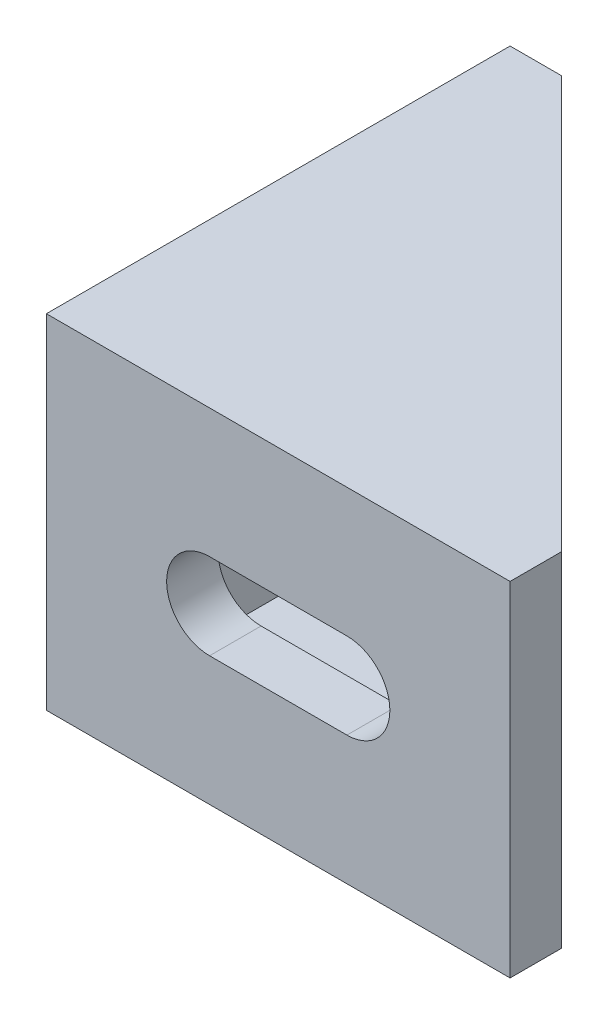
ISO-10303-21;
HEADER;
FILE_DESCRIPTION(('STEP AP214'),'2;1');
FILE_NAME('part.step','',(''),(''),'','','');
FILE_SCHEMA(('AUTOMOTIVE_DESIGN { 1 0 10303 214 1 1 1 1 }'));
ENDSEC;
DATA;
#1=APPLICATION_CONTEXT('core data for automotive mechanical design processes');
#2=APPLICATION_PROTOCOL_DEFINITION('international standard','automotive_design',2000,#1);
#3=PRODUCT_CONTEXT('',#1,'mechanical');
#4=PRODUCT('Part','Part','',(#3));
#5=PRODUCT_RELATED_PRODUCT_CATEGORY('part','',(#4));
#6=PRODUCT_DEFINITION_FORMATION('','',#4);
#7=PRODUCT_DEFINITION_CONTEXT('part definition',#1,'design');
#8=PRODUCT_DEFINITION('design','',#6,#7);
#9=PRODUCT_DEFINITION_SHAPE('','',#8);
#10=(LENGTH_UNIT() NAMED_UNIT(*) SI_UNIT(.MILLI.,.METRE.));
#11=(NAMED_UNIT(*) PLANE_ANGLE_UNIT() SI_UNIT($,.RADIAN.));
#12=(NAMED_UNIT(*) SI_UNIT($,.STERADIAN.) SOLID_ANGLE_UNIT());
#13=UNCERTAINTY_MEASURE_WITH_UNIT(LENGTH_MEASURE(1.E-05),#10,'distance_accuracy_value','');
#14=(GEOMETRIC_REPRESENTATION_CONTEXT(3) GLOBAL_UNCERTAINTY_ASSIGNED_CONTEXT((#13)) GLOBAL_UNIT_ASSIGNED_CONTEXT((#10,
#11,#12)) REPRESENTATION_CONTEXT('',''));
#15=CARTESIAN_POINT('',(0.,0.,0.));
#16=DIRECTION('',(0.,0.,1.));
#17=DIRECTION('',(1.,0.,0.));
#18=AXIS2_PLACEMENT_3D('',#15,#16,#17);
#19=CARTESIAN_POINT('',(0.,0.,0.));
#20=DIRECTION('',(0.,0.,1.));
#21=DIRECTION('',(1.,0.,0.));
#22=AXIS2_PLACEMENT_3D('',#19,#20,#21);
#23=PLANE('',#22);
#24=CARTESIAN_POINT('',(4.,0.,0.));
#25=DIRECTION('',(0.,0.,1.));
#26=DIRECTION('',(1.,0.,0.));
#27=AXIS2_PLACEMENT_3D('',#24,#25,#26);
#28=CIRCLE('',#27,2.5);
#29=CARTESIAN_POINT('',(4.,-2.5,0.));
#30=VERTEX_POINT('',#29);
#31=CARTESIAN_POINT('',(4.,2.5,0.));
#32=VERTEX_POINT('',#31);
#33=EDGE_CURVE('E223',#30,#32,#28,.T.);
#34=ORIENTED_EDGE('',*,*,#33,.T.);
#35=DIRECTION('',(-1.,0.,0.));
#36=VECTOR('',#35,1.);
#37=CARTESIAN_POINT('',(4.,2.5,0.));
#38=LINE('',#37,#36);
#39=CARTESIAN_POINT('',(-3.99999999999999,2.5,0.));
#40=VERTEX_POINT('',#39);
#41=EDGE_CURVE('E238',#32,#40,#38,.T.);
#42=ORIENTED_EDGE('',*,*,#41,.T.);
#43=CARTESIAN_POINT('',(-4.,0.,0.));
#44=DIRECTION('',(0.,0.,1.));
#45=DIRECTION('',(1.,0.,0.));
#46=AXIS2_PLACEMENT_3D('',#43,#44,#45);
#47=CIRCLE('',#46,2.5);
#48=CARTESIAN_POINT('',(-4.,-2.5,0.));
#49=VERTEX_POINT('',#48);
#50=EDGE_CURVE('E241',#40,#49,#47,.T.);
#51=ORIENTED_EDGE('',*,*,#50,.T.);
#52=DIRECTION('',(1.,0.,0.));
#53=VECTOR('',#52,1.);
#54=CARTESIAN_POINT('',(4.,-2.5,0.));
#55=LINE('',#54,#53);
#56=EDGE_CURVE('E228',#49,#30,#55,.T.);
#57=ORIENTED_EDGE('',*,*,#56,.T.);
#58=EDGE_LOOP('',(#34,#42,#51,#57));
#59=FACE_BOUND('',#58,.T.);
#60=DIRECTION('',(-1.,0.,0.));
#61=VECTOR('',#60,1.);
#62=CARTESIAN_POINT('',(0.,8.,0.));
#63=LINE('',#62,#61);
#64=CARTESIAN_POINT('',(13.5,8.,0.));
#65=VERTEX_POINT('',#64);
#66=CARTESIAN_POINT('',(-10.5,8.,0.));
#67=VERTEX_POINT('',#66);
#68=EDGE_CURVE('E194',#65,#67,#63,.T.);
#69=ORIENTED_EDGE('',*,*,#68,.F.);
#70=DIRECTION('',(0.,1.,0.));
#71=VECTOR('',#70,1.);
#72=CARTESIAN_POINT('',(13.5,10.,0.));
#73=LINE('',#72,#71);
#74=CARTESIAN_POINT('',(13.5,-8.,0.));
#75=VERTEX_POINT('',#74);
#76=EDGE_CURVE('E255',#75,#65,#73,.T.);
#77=ORIENTED_EDGE('',*,*,#76,.F.);
#78=DIRECTION('',(1.,0.,0.));
#79=VECTOR('',#78,1.);
#80=CARTESIAN_POINT('',(0.,-8.,0.));
#81=LINE('',#80,#79);
#82=CARTESIAN_POINT('',(-10.5,-8.,0.));
#83=VERTEX_POINT('',#82);
#84=EDGE_CURVE('E208',#83,#75,#81,.T.);
#85=ORIENTED_EDGE('',*,*,#84,.F.);
#86=DIRECTION('',(0.,-1.,0.));
#87=VECTOR('',#86,1.);
#88=CARTESIAN_POINT('',(-10.5,10.,0.));
#89=LINE('',#88,#87);
#90=EDGE_CURVE('E210',#67,#83,#89,.T.);
#91=ORIENTED_EDGE('',*,*,#90,.F.);
#92=EDGE_LOOP('',(#69,#77,#85,#91));
#93=FACE_BOUND('',#92,.T.);
#94=ADVANCED_FACE('F35',(#59,#93),#23,.F.);
#95=CARTESIAN_POINT('',(-10.5,10.,-24.));
#96=DIRECTION('',(-1.,0.,0.));
#97=DIRECTION('',(0.,0.,1.));
#98=AXIS2_PLACEMENT_3D('',#95,#96,#97);
#99=PLANE('',#98);
#100=DIRECTION('',(0.,0.,-1.));
#101=VECTOR('',#100,1.);
#102=CARTESIAN_POINT('',(-10.5,-2.5,-8.));
#103=LINE('',#102,#101);
#104=CARTESIAN_POINT('',(-10.5,-2.5,-8.));
#105=VERTEX_POINT('',#104);
#106=CARTESIAN_POINT('',(-10.5,-2.5,-16.));
#107=VERTEX_POINT('',#106);
#108=EDGE_CURVE('E175',#105,#107,#103,.T.);
#109=ORIENTED_EDGE('',*,*,#108,.F.);
#110=CARTESIAN_POINT('',(-10.5,0.,-8.));
#111=DIRECTION('',(1.,0.,0.));
#112=DIRECTION('',(0.,0.,-1.));
#113=AXIS2_PLACEMENT_3D('',#110,#111,#112);
#114=CIRCLE('',#113,2.5);
#115=CARTESIAN_POINT('',(-10.5,2.5,-8.));
#116=VERTEX_POINT('',#115);
#117=EDGE_CURVE('E50',#116,#105,#114,.T.);
#118=ORIENTED_EDGE('',*,*,#117,.F.);
#119=DIRECTION('',(0.,0.,1.));
#120=VECTOR('',#119,1.);
#121=CARTESIAN_POINT('',(-10.5,2.5,-8.));
#122=LINE('',#121,#120);
#123=CARTESIAN_POINT('',(-10.5,2.5,-16.));
#124=VERTEX_POINT('',#123);
#125=EDGE_CURVE('E166',#124,#116,#122,.T.);
#126=ORIENTED_EDGE('',*,*,#125,.F.);
#127=CARTESIAN_POINT('',(-10.5,0.,-16.));
#128=DIRECTION('',(1.,0.,0.));
#129=DIRECTION('',(0.,0.,-1.));
#130=AXIS2_PLACEMENT_3D('',#127,#128,#129);
#131=CIRCLE('',#130,2.5);
#132=EDGE_CURVE('E169',#107,#124,#131,.T.);
#133=ORIENTED_EDGE('',*,*,#132,.F.);
#134=EDGE_LOOP('',(#109,#118,#126,#133));
#135=FACE_BOUND('',#134,.T.);
#136=DIRECTION('',(0.,0.,-1.));
#137=VECTOR('',#136,1.);
#138=CARTESIAN_POINT('',(-10.5,8.,-24.));
#139=LINE('',#138,#137);
#140=CARTESIAN_POINT('',(-10.5,8.,-24.));
#141=VERTEX_POINT('',#140);
#142=EDGE_CURVE('E191',#67,#141,#139,.T.);
#143=ORIENTED_EDGE('',*,*,#142,.F.);
#144=ORIENTED_EDGE('',*,*,#90,.T.);
#145=DIRECTION('',(0.,0.,1.));
#146=VECTOR('',#145,1.);
#147=CARTESIAN_POINT('',(-10.5,-8.,-24.));
#148=LINE('',#147,#146);
#149=CARTESIAN_POINT('',(-10.5,-8.,-24.));
#150=VERTEX_POINT('',#149);
#151=EDGE_CURVE('E205',#150,#83,#148,.T.);
#152=ORIENTED_EDGE('',*,*,#151,.F.);
#153=DIRECTION('',(0.,-1.,0.));
#154=VECTOR('',#153,1.);
#155=CARTESIAN_POINT('',(-10.5,10.,-24.));
#156=LINE('',#155,#154);
#157=EDGE_CURVE('E216',#141,#150,#156,.T.);
#158=ORIENTED_EDGE('',*,*,#157,.F.);
#159=EDGE_LOOP('',(#143,#144,#152,#158));
#160=FACE_BOUND('',#159,.T.);
#161=ADVANCED_FACE('F309',(#135,#160),#99,.F.);
#162=CARTESIAN_POINT('',(0.,0.,3.));
#163=DIRECTION('',(0.,0.,1.));
#164=DIRECTION('',(1.,0.,0.));
#165=AXIS2_PLACEMENT_3D('',#162,#163,#164);
#166=PLANE('',#165);
#167=DIRECTION('',(0.,-1.,0.));
#168=VECTOR('',#167,1.);
#169=CARTESIAN_POINT('',(-13.5,10.,3.));
#170=LINE('',#169,#168);
#171=CARTESIAN_POINT('',(-13.5,10.,3.));
#172=VERTEX_POINT('',#171);
#173=CARTESIAN_POINT('',(-13.5,-10.,3.));
#174=VERTEX_POINT('',#173);
#175=EDGE_CURVE('E261',#172,#174,#170,.T.);
#176=ORIENTED_EDGE('',*,*,#175,.T.);
#177=DIRECTION('',(1.,0.,0.));
#178=VECTOR('',#177,1.);
#179=CARTESIAN_POINT('',(-13.5,-10.,3.));
#180=LINE('',#179,#178);
#181=CARTESIAN_POINT('',(13.5,-10.,3.));
#182=VERTEX_POINT('',#181);
#183=EDGE_CURVE('E263',#174,#182,#180,.T.);
#184=ORIENTED_EDGE('',*,*,#183,.T.);
#185=DIRECTION('',(0.,1.,0.));
#186=VECTOR('',#185,1.);
#187=CARTESIAN_POINT('',(13.5,10.,3.));
#188=LINE('',#187,#186);
#189=CARTESIAN_POINT('',(13.5,10.,3.));
#190=VERTEX_POINT('',#189);
#191=EDGE_CURVE('E256',#182,#190,#188,.T.);
#192=ORIENTED_EDGE('',*,*,#191,.T.);
#193=DIRECTION('',(-1.,0.,0.));
#194=VECTOR('',#193,1.);
#195=CARTESIAN_POINT('',(-13.5,10.,3.));
#196=LINE('',#195,#194);
#197=EDGE_CURVE('E258',#190,#172,#196,.T.);
#198=ORIENTED_EDGE('',*,*,#197,.T.);
#199=EDGE_LOOP('',(#176,#184,#192,#198));
#200=FACE_BOUND('',#199,.T.);
#201=DIRECTION('',(-1.,0.,0.));
#202=VECTOR('',#201,1.);
#203=CARTESIAN_POINT('',(4.,2.5,3.));
#204=LINE('',#203,#202);
#205=CARTESIAN_POINT('',(4.,2.5,3.));
#206=VERTEX_POINT('',#205);
#207=CARTESIAN_POINT('',(-3.99999999999999,2.5,3.));
#208=VERTEX_POINT('',#207);
#209=EDGE_CURVE('E227',#206,#208,#204,.T.);
#210=ORIENTED_EDGE('',*,*,#209,.F.);
#211=CARTESIAN_POINT('',(4.,0.,3.));
#212=DIRECTION('',(0.,0.,1.));
#213=DIRECTION('',(1.,0.,0.));
#214=AXIS2_PLACEMENT_3D('',#211,#212,#213);
#215=CIRCLE('',#214,2.5);
#216=CARTESIAN_POINT('',(4.,-2.5,3.));
#217=VERTEX_POINT('',#216);
#218=EDGE_CURVE('E225',#217,#206,#215,.T.);
#219=ORIENTED_EDGE('',*,*,#218,.F.);
#220=DIRECTION('',(1.,0.,0.));
#221=VECTOR('',#220,1.);
#222=CARTESIAN_POINT('',(4.,-2.5,3.));
#223=LINE('',#222,#221);
#224=CARTESIAN_POINT('',(-4.,-2.5,3.));
#225=VERTEX_POINT('',#224);
#226=EDGE_CURVE('E233',#225,#217,#223,.T.);
#227=ORIENTED_EDGE('',*,*,#226,.F.);
#228=CARTESIAN_POINT('',(-4.,0.,3.));
#229=DIRECTION('',(0.,0.,1.));
#230=DIRECTION('',(1.,0.,0.));
#231=AXIS2_PLACEMENT_3D('',#228,#229,#230);
#232=CIRCLE('',#231,2.5);
#233=EDGE_CURVE('E230',#208,#225,#232,.T.);
#234=ORIENTED_EDGE('',*,*,#233,.F.);
#235=EDGE_LOOP('',(#210,#219,#227,#234));
#236=FACE_BOUND('',#235,.T.);
#237=ADVANCED_FACE('F291',(#200,#236),#166,.T.);
#238=CARTESIAN_POINT('',(13.5,10.,3.));
#239=DIRECTION('',(-1.,0.,0.));
#240=DIRECTION('',(0.,-1.,0.));
#241=AXIS2_PLACEMENT_3D('',#238,#239,#240);
#242=PLANE('',#241);
#243=DIRECTION('',(0.,0.,-1.));
#244=VECTOR('',#243,1.);
#245=CARTESIAN_POINT('',(13.5,10.,3.));
#246=LINE('',#245,#244);
#247=CARTESIAN_POINT('',(13.5,10.,0.));
#248=VERTEX_POINT('',#247);
#249=EDGE_CURVE('E11',#190,#248,#246,.T.);
#250=ORIENTED_EDGE('',*,*,#249,.F.);
#251=ORIENTED_EDGE('',*,*,#191,.F.);
#252=DIRECTION('',(0.,0.,-1.));
#253=VECTOR('',#252,1.);
#254=CARTESIAN_POINT('',(13.5,-10.,3.));
#255=LINE('',#254,#253);
#256=CARTESIAN_POINT('',(13.5,-10.,0.));
#257=VERTEX_POINT('',#256);
#258=EDGE_CURVE('E265',#182,#257,#255,.T.);
#259=ORIENTED_EDGE('',*,*,#258,.T.);
#260=EDGE_CURVE('E259',#257,#75,#73,.T.);
#261=ORIENTED_EDGE('',*,*,#260,.T.);
#262=ORIENTED_EDGE('',*,*,#76,.T.);
#263=DIRECTION('',(0.,1.,0.));
#264=VECTOR('',#263,1.);
#265=CARTESIAN_POINT('',(13.5,8.,0.));
#266=LINE('',#265,#264);
#267=EDGE_CURVE('E187',#65,#248,#266,.T.);
#268=ORIENTED_EDGE('',*,*,#267,.T.);
#269=EDGE_LOOP('',(#250,#251,#259,#261,#262,#268));
#270=FACE_BOUND('',#269,.T.);
#271=ADVANCED_FACE('F37',(#270),#242,.F.);
#272=CARTESIAN_POINT('',(-13.5,10.,3.));
#273=DIRECTION('',(0.,-1.,0.));
#274=DIRECTION('',(1.,0.,0.));
#275=AXIS2_PLACEMENT_3D('',#272,#273,#274);
#276=PLANE('',#275);
#277=ORIENTED_EDGE('',*,*,#249,.T.);
#278=DIRECTION('',(0.707106781186548,0.,0.707106781186548));
#279=VECTOR('',#278,1.);
#280=CARTESIAN_POINT('',(-10.5,10.,-24.));
#281=LINE('',#280,#279);
#282=CARTESIAN_POINT('',(-10.5,10.,-24.));
#283=VERTEX_POINT('',#282);
#284=EDGE_CURVE('E181',#283,#248,#281,.T.);
#285=ORIENTED_EDGE('',*,*,#284,.F.);
#286=DIRECTION('',(1.,0.,0.));
#287=VECTOR('',#286,1.);
#288=CARTESIAN_POINT('',(-13.5,10.,-24.));
#289=LINE('',#288,#287);
#290=CARTESIAN_POINT('',(-13.5,10.,-24.));
#291=VERTEX_POINT('',#290);
#292=EDGE_CURVE('E213',#291,#283,#289,.T.);
#293=ORIENTED_EDGE('',*,*,#292,.F.);
#294=DIRECTION('',(0.,0.,-1.));
#295=VECTOR('',#294,1.);
#296=CARTESIAN_POINT('',(-13.5,10.,3.));
#297=LINE('',#296,#295);
#298=EDGE_CURVE('E43',#172,#291,#297,.T.);
#299=ORIENTED_EDGE('',*,*,#298,.F.);
#300=ORIENTED_EDGE('',*,*,#197,.F.);
#301=EDGE_LOOP('',(#277,#285,#293,#299,#300));
#302=FACE_BOUND('',#301,.T.);
#303=ADVANCED_FACE('F279',(#302),#276,.F.);
#304=CARTESIAN_POINT('',(-13.5,10.,3.));
#305=DIRECTION('',(1.,0.,0.));
#306=DIRECTION('',(0.,1.,0.));
#307=AXIS2_PLACEMENT_3D('',#304,#305,#306);
#308=PLANE('',#307);
#309=DIRECTION('',(0.,0.,1.));
#310=VECTOR('',#309,1.);
#311=CARTESIAN_POINT('',(-13.5,2.5,-8.));
#312=LINE('',#311,#310);
#313=CARTESIAN_POINT('',(-13.5,2.5,-16.));
#314=VERTEX_POINT('',#313);
#315=CARTESIAN_POINT('',(-13.5,2.5,-8.));
#316=VERTEX_POINT('',#315);
#317=EDGE_CURVE('E156',#314,#316,#312,.T.);
#318=ORIENTED_EDGE('',*,*,#317,.T.);
#319=CARTESIAN_POINT('',(-13.5,0.,-8.));
#320=DIRECTION('',(1.,0.,0.));
#321=DIRECTION('',(0.,0.,-1.));
#322=AXIS2_PLACEMENT_3D('',#319,#320,#321);
#323=CIRCLE('',#322,2.5);
#324=CARTESIAN_POINT('',(-13.5,-2.5,-8.));
#325=VERTEX_POINT('',#324);
#326=EDGE_CURVE('E150',#316,#325,#323,.T.);
#327=ORIENTED_EDGE('',*,*,#326,.T.);
#328=DIRECTION('',(0.,0.,-1.));
#329=VECTOR('',#328,1.);
#330=CARTESIAN_POINT('',(-13.5,-2.5,-8.));
#331=LINE('',#330,#329);
#332=CARTESIAN_POINT('',(-13.5,-2.5,-16.));
#333=VERTEX_POINT('',#332);
#334=EDGE_CURVE('E159',#325,#333,#331,.T.);
#335=ORIENTED_EDGE('',*,*,#334,.T.);
#336=CARTESIAN_POINT('',(-13.5,0.,-16.));
#337=DIRECTION('',(1.,0.,0.));
#338=DIRECTION('',(0.,0.,-1.));
#339=AXIS2_PLACEMENT_3D('',#336,#337,#338);
#340=CIRCLE('',#339,2.5);
#341=EDGE_CURVE('E58',#333,#314,#340,.T.);
#342=ORIENTED_EDGE('',*,*,#341,.T.);
#343=EDGE_LOOP('',(#318,#327,#335,#342));
#344=FACE_BOUND('',#343,.T.);
#345=ORIENTED_EDGE('',*,*,#298,.T.);
#346=DIRECTION('',(0.,1.,0.));
#347=VECTOR('',#346,1.);
#348=CARTESIAN_POINT('',(-13.5,10.,-24.));
#349=LINE('',#348,#347);
#350=CARTESIAN_POINT('',(-13.5,-10.,-24.));
#351=VERTEX_POINT('',#350);
#352=EDGE_CURVE('E211',#351,#291,#349,.T.);
#353=ORIENTED_EDGE('',*,*,#352,.F.);
#354=DIRECTION('',(0.,0.,-1.));
#355=VECTOR('',#354,1.);
#356=CARTESIAN_POINT('',(-13.5,-10.,3.));
#357=LINE('',#356,#355);
#358=EDGE_CURVE('E270',#174,#351,#357,.T.);
#359=ORIENTED_EDGE('',*,*,#358,.F.);
#360=ORIENTED_EDGE('',*,*,#175,.F.);
#361=EDGE_LOOP('',(#345,#353,#359,#360));
#362=FACE_BOUND('',#361,.T.);
#363=ADVANCED_FACE('F163',(#344,#362),#308,.F.);
#364=CARTESIAN_POINT('',(-13.5,-10.,3.));
#365=DIRECTION('',(0.,1.,0.));
#366=DIRECTION('',(-1.,0.,0.));
#367=AXIS2_PLACEMENT_3D('',#364,#365,#366);
#368=PLANE('',#367);
#369=DIRECTION('',(0.707106781186548,0.,0.707106781186548));
#370=VECTOR('',#369,1.);
#371=CARTESIAN_POINT('',(-10.5,-10.,-24.));
#372=LINE('',#371,#370);
#373=CARTESIAN_POINT('',(-10.5,-10.,-24.));
#374=VERTEX_POINT('',#373);
#375=EDGE_CURVE('E196',#374,#257,#372,.T.);
#376=ORIENTED_EDGE('',*,*,#375,.T.);
#377=ORIENTED_EDGE('',*,*,#258,.F.);
#378=ORIENTED_EDGE('',*,*,#183,.F.);
#379=ORIENTED_EDGE('',*,*,#358,.T.);
#380=DIRECTION('',(-1.,0.,0.));
#381=VECTOR('',#380,1.);
#382=CARTESIAN_POINT('',(-13.5,-10.,-24.));
#383=LINE('',#382,#381);
#384=EDGE_CURVE('E220',#374,#351,#383,.T.);
#385=ORIENTED_EDGE('',*,*,#384,.F.);
#386=EDGE_LOOP('',(#376,#377,#378,#379,#385));
#387=FACE_BOUND('',#386,.T.);
#388=ADVANCED_FACE('F286',(#387),#368,.F.);
#389=CARTESIAN_POINT('',(4.,0.,3.));
#390=DIRECTION('',(0.,0.,-1.));
#391=DIRECTION('',(-1.,0.,0.));
#392=AXIS2_PLACEMENT_3D('',#389,#390,#391);
#393=CYLINDRICAL_SURFACE('',#392,2.5);
#394=ORIENTED_EDGE('',*,*,#33,.F.);
#395=DIRECTION('',(0.,0.,-1.));
#396=VECTOR('',#395,1.);
#397=CARTESIAN_POINT('',(4.,-2.5,3.));
#398=LINE('',#397,#396);
#399=EDGE_CURVE('E235',#217,#30,#398,.T.);
#400=ORIENTED_EDGE('',*,*,#399,.F.);
#401=ORIENTED_EDGE('',*,*,#218,.T.);
#402=DIRECTION('',(0.,0.,-1.));
#403=VECTOR('',#402,1.);
#404=CARTESIAN_POINT('',(4.,2.5,3.));
#405=LINE('',#404,#403);
#406=EDGE_CURVE('E252',#206,#32,#405,.T.);
#407=ORIENTED_EDGE('',*,*,#406,.T.);
#408=EDGE_LOOP('',(#394,#400,#401,#407));
#409=FACE_BOUND('',#408,.T.);
#410=ADVANCED_FACE('F339',(#409),#393,.F.);
#411=CARTESIAN_POINT('',(4.,2.5,3.));
#412=DIRECTION('',(0.,-1.,0.));
#413=DIRECTION('',(1.,0.,0.));
#414=AXIS2_PLACEMENT_3D('',#411,#412,#413);
#415=PLANE('',#414);
#416=ORIENTED_EDGE('',*,*,#41,.F.);
#417=ORIENTED_EDGE('',*,*,#406,.F.);
#418=ORIENTED_EDGE('',*,*,#209,.T.);
#419=DIRECTION('',(0.,0.,-1.));
#420=VECTOR('',#419,1.);
#421=CARTESIAN_POINT('',(-3.99999999999999,2.5,3.));
#422=LINE('',#421,#420);
#423=EDGE_CURVE('E250',#208,#40,#422,.T.);
#424=ORIENTED_EDGE('',*,*,#423,.T.);
#425=EDGE_LOOP('',(#416,#417,#418,#424));
#426=FACE_BOUND('',#425,.T.);
#427=ADVANCED_FACE('F458',(#426),#415,.T.);
#428=CARTESIAN_POINT('',(-4.,0.,3.));
#429=DIRECTION('',(0.,0.,-1.));
#430=DIRECTION('',(-1.,0.,0.));
#431=AXIS2_PLACEMENT_3D('',#428,#429,#430);
#432=CYLINDRICAL_SURFACE('',#431,2.5);
#433=ORIENTED_EDGE('',*,*,#50,.F.);
#434=ORIENTED_EDGE('',*,*,#423,.F.);
#435=ORIENTED_EDGE('',*,*,#233,.T.);
#436=DIRECTION('',(0.,0.,-1.));
#437=VECTOR('',#436,1.);
#438=CARTESIAN_POINT('',(-4.,-2.5,3.));
#439=LINE('',#438,#437);
#440=EDGE_CURVE('E248',#225,#49,#439,.T.);
#441=ORIENTED_EDGE('',*,*,#440,.T.);
#442=EDGE_LOOP('',(#433,#434,#435,#441));
#443=FACE_BOUND('',#442,.T.);
#444=ADVANCED_FACE('F451',(#443),#432,.F.);
#445=CARTESIAN_POINT('',(4.,-2.5,3.));
#446=DIRECTION('',(0.,1.,0.));
#447=DIRECTION('',(0.,0.,1.));
#448=AXIS2_PLACEMENT_3D('',#445,#446,#447);
#449=PLANE('',#448);
#450=ORIENTED_EDGE('',*,*,#56,.F.);
#451=ORIENTED_EDGE('',*,*,#440,.F.);
#452=ORIENTED_EDGE('',*,*,#226,.T.);
#453=ORIENTED_EDGE('',*,*,#399,.T.);
#454=EDGE_LOOP('',(#450,#451,#452,#453));
#455=FACE_BOUND('',#454,.T.);
#456=ADVANCED_FACE('F323',(#455),#449,.T.);
#457=CARTESIAN_POINT('',(0.,0.,-24.));
#458=DIRECTION('',(0.,0.,1.));
#459=DIRECTION('',(1.,0.,0.));
#460=AXIS2_PLACEMENT_3D('',#457,#458,#459);
#461=PLANE('',#460);
#462=EDGE_CURVE('E217',#283,#141,#156,.T.);
#463=ORIENTED_EDGE('',*,*,#462,.T.);
#464=ORIENTED_EDGE('',*,*,#157,.T.);
#465=DIRECTION('',(0.,-1.,0.));
#466=VECTOR('',#465,1.);
#467=CARTESIAN_POINT('',(-10.5,-8.,-24.));
#468=LINE('',#467,#466);
#469=EDGE_CURVE('E200',#150,#374,#468,.T.);
#470=ORIENTED_EDGE('',*,*,#469,.T.);
#471=ORIENTED_EDGE('',*,*,#384,.T.);
#472=ORIENTED_EDGE('',*,*,#352,.T.);
#473=ORIENTED_EDGE('',*,*,#292,.T.);
#474=EDGE_LOOP('',(#463,#464,#470,#471,#472,#473));
#475=FACE_BOUND('',#474,.T.);
#476=ADVANCED_FACE('F282',(#475),#461,.F.);
#477=CARTESIAN_POINT('',(0.,-8.,0.));
#478=DIRECTION('',(0.,-1.,0.));
#479=DIRECTION('',(0.,0.,-1.));
#480=AXIS2_PLACEMENT_3D('',#477,#478,#479);
#481=PLANE('',#480);
#482=ORIENTED_EDGE('',*,*,#151,.T.);
#483=ORIENTED_EDGE('',*,*,#84,.T.);
#484=DIRECTION('',(0.707106781186548,0.,0.707106781186548));
#485=VECTOR('',#484,1.);
#486=CARTESIAN_POINT('',(-10.5,-8.,-24.));
#487=LINE('',#486,#485);
#488=EDGE_CURVE('E197',#150,#75,#487,.T.);
#489=ORIENTED_EDGE('',*,*,#488,.F.);
#490=EDGE_LOOP('',(#482,#483,#489));
#491=FACE_BOUND('',#490,.T.);
#492=ADVANCED_FACE('F315',(#491),#481,.F.);
#493=CARTESIAN_POINT('',(-10.5,-8.,-24.));
#494=DIRECTION('',(0.707106781186547,0.,-0.707106781186547));
#495=DIRECTION('',(-0.707106781186548,0.,-0.707106781186548));
#496=AXIS2_PLACEMENT_3D('',#493,#494,#495);
#497=PLANE('',#496);
#498=ORIENTED_EDGE('',*,*,#375,.F.);
#499=ORIENTED_EDGE('',*,*,#469,.F.);
#500=ORIENTED_EDGE('',*,*,#488,.T.);
#501=ORIENTED_EDGE('',*,*,#260,.F.);
#502=EDGE_LOOP('',(#498,#499,#500,#501));
#503=FACE_BOUND('',#502,.T.);
#504=ADVANCED_FACE('F313',(#503),#497,.T.);
#505=CARTESIAN_POINT('',(0.,8.,0.));
#506=DIRECTION('',(0.,1.,0.));
#507=DIRECTION('',(0.,0.,-1.));
#508=AXIS2_PLACEMENT_3D('',#505,#506,#507);
#509=PLANE('',#508);
#510=DIRECTION('',(0.707106781186548,0.,0.707106781186548));
#511=VECTOR('',#510,1.);
#512=CARTESIAN_POINT('',(-10.5,8.,-24.));
#513=LINE('',#512,#511);
#514=EDGE_CURVE('E185',#141,#65,#513,.T.);
#515=ORIENTED_EDGE('',*,*,#514,.T.);
#516=ORIENTED_EDGE('',*,*,#68,.T.);
#517=ORIENTED_EDGE('',*,*,#142,.T.);
#518=EDGE_LOOP('',(#515,#516,#517));
#519=FACE_BOUND('',#518,.T.);
#520=ADVANCED_FACE('F306',(#519),#509,.F.);
#521=CARTESIAN_POINT('',(-10.5,8.,-24.));
#522=DIRECTION('',(-0.707106781186547,0.,0.707106781186547));
#523=DIRECTION('',(0.707106781186548,0.,0.707106781186548));
#524=AXIS2_PLACEMENT_3D('',#521,#522,#523);
#525=PLANE('',#524);
#526=ORIENTED_EDGE('',*,*,#284,.T.);
#527=ORIENTED_EDGE('',*,*,#267,.F.);
#528=ORIENTED_EDGE('',*,*,#514,.F.);
#529=ORIENTED_EDGE('',*,*,#462,.F.);
#530=EDGE_LOOP('',(#526,#527,#528,#529));
#531=FACE_BOUND('',#530,.T.);
#532=ADVANCED_FACE('F300',(#531),#525,.F.);
#533=CARTESIAN_POINT('',(-13.5,0.,-8.));
#534=DIRECTION('',(1.,0.,0.));
#535=DIRECTION('',(0.,0.,-1.));
#536=AXIS2_PLACEMENT_3D('',#533,#534,#535);
#537=CYLINDRICAL_SURFACE('',#536,2.5);
#538=ORIENTED_EDGE('',*,*,#117,.T.);
#539=DIRECTION('',(1.,0.,0.));
#540=VECTOR('',#539,1.);
#541=CARTESIAN_POINT('',(-13.5,-2.5,-8.));
#542=LINE('',#541,#540);
#543=EDGE_CURVE('E146',#325,#105,#542,.T.);
#544=ORIENTED_EDGE('',*,*,#543,.F.);
#545=ORIENTED_EDGE('',*,*,#326,.F.);
#546=DIRECTION('',(1.,0.,0.));
#547=VECTOR('',#546,1.);
#548=CARTESIAN_POINT('',(-13.5,2.5,-8.));
#549=LINE('',#548,#547);
#550=EDGE_CURVE('E179',#316,#116,#549,.T.);
#551=ORIENTED_EDGE('',*,*,#550,.T.);
#552=EDGE_LOOP('',(#538,#544,#545,#551));
#553=FACE_BOUND('',#552,.T.);
#554=ADVANCED_FACE('F148',(#553),#537,.F.);
#555=CARTESIAN_POINT('',(-13.5,2.5,-8.));
#556=DIRECTION('',(0.,1.,0.));
#557=DIRECTION('',(0.,0.,1.));
#558=AXIS2_PLACEMENT_3D('',#555,#556,#557);
#559=PLANE('',#558);
#560=ORIENTED_EDGE('',*,*,#125,.T.);
#561=ORIENTED_EDGE('',*,*,#550,.F.);
#562=ORIENTED_EDGE('',*,*,#317,.F.);
#563=DIRECTION('',(1.,0.,0.));
#564=VECTOR('',#563,1.);
#565=CARTESIAN_POINT('',(-13.5,2.5,-16.));
#566=LINE('',#565,#564);
#567=EDGE_CURVE('E182',#314,#124,#566,.T.);
#568=ORIENTED_EDGE('',*,*,#567,.T.);
#569=EDGE_LOOP('',(#560,#561,#562,#568));
#570=FACE_BOUND('',#569,.T.);
#571=ADVANCED_FACE('F379',(#570),#559,.F.);
#572=CARTESIAN_POINT('',(-13.5,0.,-16.));
#573=DIRECTION('',(1.,0.,0.));
#574=DIRECTION('',(0.,0.,-1.));
#575=AXIS2_PLACEMENT_3D('',#572,#573,#574);
#576=CYLINDRICAL_SURFACE('',#575,2.5);
#577=ORIENTED_EDGE('',*,*,#132,.T.);
#578=ORIENTED_EDGE('',*,*,#567,.F.);
#579=ORIENTED_EDGE('',*,*,#341,.F.);
#580=DIRECTION('',(1.,0.,0.));
#581=VECTOR('',#580,1.);
#582=CARTESIAN_POINT('',(-13.5,-2.5,-16.));
#583=LINE('',#582,#581);
#584=EDGE_CURVE('E155',#333,#107,#583,.T.);
#585=ORIENTED_EDGE('',*,*,#584,.T.);
#586=EDGE_LOOP('',(#577,#578,#579,#585));
#587=FACE_BOUND('',#586,.T.);
#588=ADVANCED_FACE('F388',(#587),#576,.F.);
#589=CARTESIAN_POINT('',(-13.5,-2.5,-8.));
#590=DIRECTION('',(0.,-1.,0.));
#591=DIRECTION('',(0.,0.,-1.));
#592=AXIS2_PLACEMENT_3D('',#589,#590,#591);
#593=PLANE('',#592);
#594=ORIENTED_EDGE('',*,*,#108,.T.);
#595=ORIENTED_EDGE('',*,*,#584,.F.);
#596=ORIENTED_EDGE('',*,*,#334,.F.);
#597=ORIENTED_EDGE('',*,*,#543,.T.);
#598=EDGE_LOOP('',(#594,#595,#596,#597));
#599=FACE_BOUND('',#598,.T.);
#600=ADVANCED_FACE('F160',(#599),#593,.F.);
#601=CLOSED_SHELL('',(#94,#161,#237,#271,#303,#363,#388,#410,#427,#444,#456,#476,#492,#504,#520,
#532,#554,#571,#588,#600));
#602=MANIFOLD_SOLID_BREP('B2',#601);
#603=ADVANCED_BREP_SHAPE_REPRESENTATION('',(#18,#602),#14);
#604=SHAPE_DEFINITION_REPRESENTATION(#9,#603);
ENDSEC;
END-ISO-10303-21;
